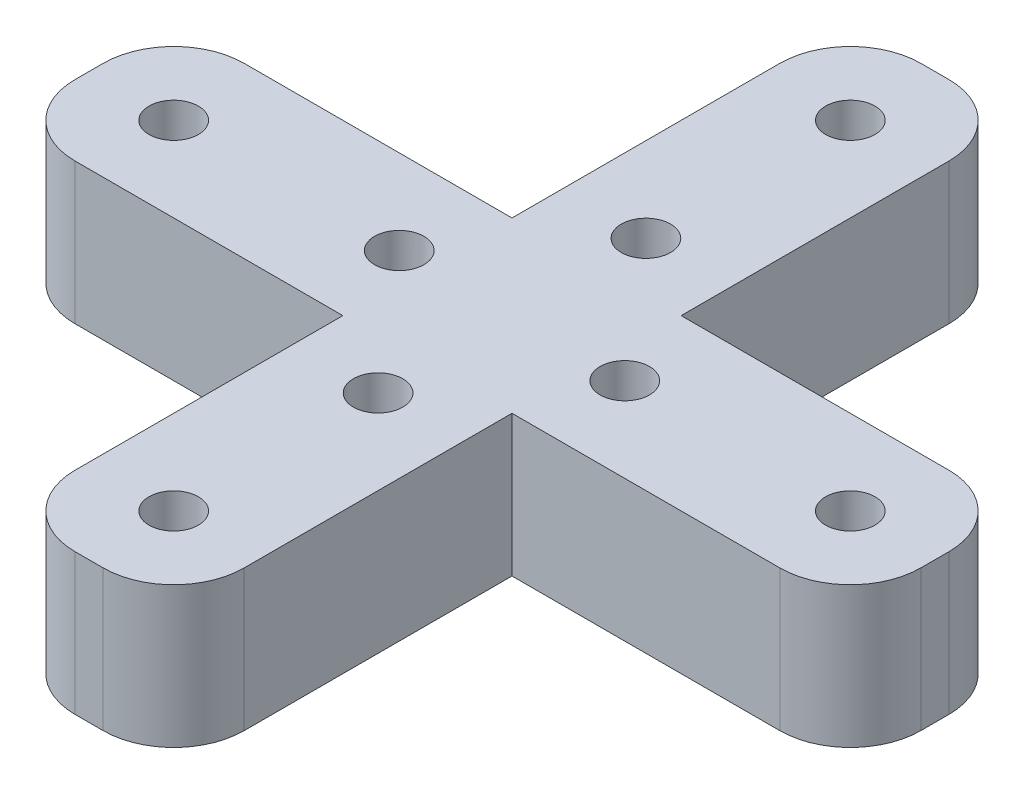
ISO-10303-21;
HEADER;
FILE_DESCRIPTION(('STEP AP214'),'2;1');
FILE_NAME('part.step','',(''),(''),'','','');
FILE_SCHEMA(('AUTOMOTIVE_DESIGN { 1 0 10303 214 1 1 1 1 }'));
ENDSEC;
DATA;
#1=APPLICATION_CONTEXT('core data for automotive mechanical design processes');
#2=APPLICATION_PROTOCOL_DEFINITION('international standard','automotive_design',2000,#1);
#3=PRODUCT_CONTEXT('',#1,'mechanical');
#4=PRODUCT('Part','Part','',(#3));
#5=PRODUCT_RELATED_PRODUCT_CATEGORY('part','',(#4));
#6=PRODUCT_DEFINITION_FORMATION('','',#4);
#7=PRODUCT_DEFINITION_CONTEXT('part definition',#1,'design');
#8=PRODUCT_DEFINITION('design','',#6,#7);
#9=PRODUCT_DEFINITION_SHAPE('','',#8);
#10=(LENGTH_UNIT() NAMED_UNIT(*) SI_UNIT(.MILLI.,.METRE.));
#11=(NAMED_UNIT(*) PLANE_ANGLE_UNIT() SI_UNIT($,.RADIAN.));
#12=(NAMED_UNIT(*) SI_UNIT($,.STERADIAN.) SOLID_ANGLE_UNIT());
#13=UNCERTAINTY_MEASURE_WITH_UNIT(LENGTH_MEASURE(1.E-05),#10,'distance_accuracy_value','');
#14=(GEOMETRIC_REPRESENTATION_CONTEXT(3) GLOBAL_UNCERTAINTY_ASSIGNED_CONTEXT((#13)) GLOBAL_UNIT_ASSIGNED_CONTEXT((#10,
#11,#12)) REPRESENTATION_CONTEXT('',''));
#15=CARTESIAN_POINT('',(0.,0.,0.));
#16=DIRECTION('',(0.,0.,1.));
#17=DIRECTION('',(1.,0.,0.));
#18=AXIS2_PLACEMENT_3D('',#15,#16,#17);
#19=CARTESIAN_POINT('',(-8.,-5.,0.));
#20=DIRECTION('',(0.,1.,0.));
#21=DIRECTION('',(0.,0.,1.));
#22=AXIS2_PLACEMENT_3D('',#19,#20,#21);
#23=CYLINDRICAL_SURFACE('',#22,1.75);
#24=CARTESIAN_POINT('',(-8.,10.,0.));
#25=DIRECTION('',(0.,1.,0.));
#26=DIRECTION('',(0.,0.,1.));
#27=AXIS2_PLACEMENT_3D('',#24,#25,#26);
#28=CIRCLE('',#27,1.75);
#29=CARTESIAN_POINT('',(-8.,10.,1.75));
#30=VERTEX_POINT('',#29);
#31=EDGE_CURVE('E230',#30,#30,#28,.T.);
#32=ORIENTED_EDGE('',*,*,#31,.T.);
#33=EDGE_LOOP('',(#32));
#34=FACE_BOUND('',#33,.T.);
#35=CARTESIAN_POINT('',(-8.,3.,0.));
#36=DIRECTION('',(0.,-1.,0.));
#37=DIRECTION('',(0.,0.,-1.));
#38=AXIS2_PLACEMENT_3D('',#35,#36,#37);
#39=CIRCLE('',#38,1.75);
#40=CARTESIAN_POINT('',(-8.,3.,-1.75));
#41=VERTEX_POINT('',#40);
#42=EDGE_CURVE('E39',#41,#41,#39,.F.);
#43=ORIENTED_EDGE('',*,*,#42,.F.);
#44=EDGE_LOOP('',(#43));
#45=FACE_BOUND('',#44,.T.);
#46=ADVANCED_FACE('F35',(#34,#45),#23,.F.);
#47=CARTESIAN_POINT('',(0.,-5.,9.50000000000001));
#48=DIRECTION('',(0.,1.,0.));
#49=DIRECTION('',(0.,0.,1.));
#50=AXIS2_PLACEMENT_3D('',#47,#48,#49);
#51=CYLINDRICAL_SURFACE('',#50,1.75);
#52=CARTESIAN_POINT('',(0.,10.,9.50000000000001));
#53=DIRECTION('',(0.,1.,0.));
#54=DIRECTION('',(0.,0.,1.));
#55=AXIS2_PLACEMENT_3D('',#52,#53,#54);
#56=CIRCLE('',#55,1.75);
#57=CARTESIAN_POINT('',(0.,10.,11.25));
#58=VERTEX_POINT('',#57);
#59=EDGE_CURVE('E330',#58,#58,#56,.T.);
#60=ORIENTED_EDGE('',*,*,#59,.T.);
#61=EDGE_LOOP('',(#60));
#62=FACE_BOUND('',#61,.T.);
#63=CARTESIAN_POINT('',(0.,3.,9.50000000000001));
#64=DIRECTION('',(0.,-1.,0.));
#65=DIRECTION('',(0.,0.,-1.));
#66=AXIS2_PLACEMENT_3D('',#63,#64,#65);
#67=CIRCLE('',#66,1.75);
#68=CARTESIAN_POINT('',(0.,3.,7.75000000000001));
#69=VERTEX_POINT('',#68);
#70=EDGE_CURVE('E349',#69,#69,#67,.F.);
#71=ORIENTED_EDGE('',*,*,#70,.F.);
#72=EDGE_LOOP('',(#71));
#73=FACE_BOUND('',#72,.T.);
#74=ADVANCED_FACE('F473',(#62,#73),#51,.F.);
#75=CARTESIAN_POINT('',(8.,-5.,0.));
#76=DIRECTION('',(0.,1.,0.));
#77=DIRECTION('',(0.,0.,1.));
#78=AXIS2_PLACEMENT_3D('',#75,#76,#77);
#79=CYLINDRICAL_SURFACE('',#78,1.75);
#80=CARTESIAN_POINT('',(8.,10.,0.));
#81=DIRECTION('',(0.,1.,0.));
#82=DIRECTION('',(0.,0.,1.));
#83=AXIS2_PLACEMENT_3D('',#80,#81,#82);
#84=CIRCLE('',#83,1.75);
#85=CARTESIAN_POINT('',(8.,10.,1.75));
#86=VERTEX_POINT('',#85);
#87=EDGE_CURVE('E375',#86,#86,#84,.T.);
#88=ORIENTED_EDGE('',*,*,#87,.T.);
#89=EDGE_LOOP('',(#88));
#90=FACE_BOUND('',#89,.T.);
#91=CARTESIAN_POINT('',(8.,3.,0.));
#92=DIRECTION('',(0.,-1.,0.));
#93=DIRECTION('',(0.,0.,-1.));
#94=AXIS2_PLACEMENT_3D('',#91,#92,#93);
#95=CIRCLE('',#94,1.75);
#96=CARTESIAN_POINT('',(8.,3.,-1.75));
#97=VERTEX_POINT('',#96);
#98=EDGE_CURVE('E347',#97,#97,#95,.F.);
#99=ORIENTED_EDGE('',*,*,#98,.F.);
#100=EDGE_LOOP('',(#99));
#101=FACE_BOUND('',#100,.T.);
#102=ADVANCED_FACE('F468',(#90,#101),#79,.F.);
#103=CARTESIAN_POINT('',(0.,-5.,-9.49999999999999));
#104=DIRECTION('',(0.,1.,0.));
#105=DIRECTION('',(0.,0.,1.));
#106=AXIS2_PLACEMENT_3D('',#103,#104,#105);
#107=CYLINDRICAL_SURFACE('',#106,1.75);
#108=CARTESIAN_POINT('',(0.,10.,-9.49999999999999));
#109=DIRECTION('',(0.,1.,0.));
#110=DIRECTION('',(0.,0.,1.));
#111=AXIS2_PLACEMENT_3D('',#108,#109,#110);
#112=CIRCLE('',#111,1.75);
#113=CARTESIAN_POINT('',(0.,10.,-7.74999999999999));
#114=VERTEX_POINT('',#113);
#115=EDGE_CURVE('E378',#114,#114,#112,.T.);
#116=ORIENTED_EDGE('',*,*,#115,.T.);
#117=EDGE_LOOP('',(#116));
#118=FACE_BOUND('',#117,.T.);
#119=CARTESIAN_POINT('',(0.,3.,-9.49999999999999));
#120=DIRECTION('',(0.,-1.,0.));
#121=DIRECTION('',(0.,0.,-1.));
#122=AXIS2_PLACEMENT_3D('',#119,#120,#121);
#123=CIRCLE('',#122,1.75);
#124=CARTESIAN_POINT('',(0.,3.,-11.25));
#125=VERTEX_POINT('',#124);
#126=EDGE_CURVE('E342',#125,#125,#123,.F.);
#127=ORIENTED_EDGE('',*,*,#126,.F.);
#128=EDGE_LOOP('',(#127));
#129=FACE_BOUND('',#128,.T.);
#130=ADVANCED_FACE('F461',(#118,#129),#107,.F.);
#131=CARTESIAN_POINT('',(6.,10.,-5.99999999999999));
#132=DIRECTION('',(-1.,0.,0.));
#133=DIRECTION('',(0.,0.,1.));
#134=AXIS2_PLACEMENT_3D('',#131,#132,#133);
#135=PLANE('',#134);
#136=DIRECTION('',(0.,0.,-1.));
#137=VECTOR('',#136,1.);
#138=CARTESIAN_POINT('',(6.,0.,-5.99999999999999));
#139=LINE('',#138,#137);
#140=CARTESIAN_POINT('',(6.,0.,-5.99999999999999));
#141=VERTEX_POINT('',#140);
#142=CARTESIAN_POINT('',(6.,0.,-25.));
#143=VERTEX_POINT('',#142);
#144=EDGE_CURVE('E226',#141,#143,#139,.T.);
#145=ORIENTED_EDGE('',*,*,#144,.T.);
#146=DIRECTION('',(0.,-1.,0.));
#147=VECTOR('',#146,1.);
#148=CARTESIAN_POINT('',(6.,10.,-25.));
#149=LINE('',#148,#147);
#150=CARTESIAN_POINT('',(6.,10.,-25.));
#151=VERTEX_POINT('',#150);
#152=EDGE_CURVE('E317',#143,#151,#149,.F.);
#153=ORIENTED_EDGE('',*,*,#152,.T.);
#154=DIRECTION('',(0.,0.,-1.));
#155=VECTOR('',#154,1.);
#156=CARTESIAN_POINT('',(6.,10.,-5.99999999999999));
#157=LINE('',#156,#155);
#158=CARTESIAN_POINT('',(6.,10.,-5.99999999999999));
#159=VERTEX_POINT('',#158);
#160=EDGE_CURVE('E256',#159,#151,#157,.T.);
#161=ORIENTED_EDGE('',*,*,#160,.F.);
#162=DIRECTION('',(0.,-1.,0.));
#163=VECTOR('',#162,1.);
#164=CARTESIAN_POINT('',(6.,10.,-5.99999999999999));
#165=LINE('',#164,#163);
#166=EDGE_CURVE('E225',#159,#141,#165,.T.);
#167=ORIENTED_EDGE('',*,*,#166,.T.);
#168=EDGE_LOOP('',(#145,#153,#161,#167));
#169=FACE_BOUND('',#168,.T.);
#170=ADVANCED_FACE('F459',(#169),#135,.F.);
#171=CARTESIAN_POINT('',(-6.,10.,-30.));
#172=DIRECTION('',(0.,0.,1.));
#173=DIRECTION('',(1.,0.,0.));
#174=AXIS2_PLACEMENT_3D('',#171,#172,#173);
#175=PLANE('',#174);
#176=DIRECTION('',(-1.,0.,0.));
#177=VECTOR('',#176,1.);
#178=CARTESIAN_POINT('',(-6.,10.,-30.));
#179=LINE('',#178,#177);
#180=CARTESIAN_POINT('',(1.,10.,-30.));
#181=VERTEX_POINT('',#180);
#182=CARTESIAN_POINT('',(-1.,10.,-30.));
#183=VERTEX_POINT('',#182);
#184=EDGE_CURVE('E188',#181,#183,#179,.T.);
#185=ORIENTED_EDGE('',*,*,#184,.F.);
#186=DIRECTION('',(0.,-1.,0.));
#187=VECTOR('',#186,1.);
#188=CARTESIAN_POINT('',(1.,10.,-30.));
#189=LINE('',#188,#187);
#190=CARTESIAN_POINT('',(1.,0.,-30.));
#191=VERTEX_POINT('',#190);
#192=EDGE_CURVE('E314',#181,#191,#189,.T.);
#193=ORIENTED_EDGE('',*,*,#192,.T.);
#194=DIRECTION('',(-1.,0.,0.));
#195=VECTOR('',#194,1.);
#196=CARTESIAN_POINT('',(-6.,0.,-30.));
#197=LINE('',#196,#195);
#198=CARTESIAN_POINT('',(-1.,0.,-30.));
#199=VERTEX_POINT('',#198);
#200=EDGE_CURVE('E229',#191,#199,#197,.T.);
#201=ORIENTED_EDGE('',*,*,#200,.T.);
#202=DIRECTION('',(0.,-1.,0.));
#203=VECTOR('',#202,1.);
#204=CARTESIAN_POINT('',(-1.,10.,-30.));
#205=LINE('',#204,#203);
#206=EDGE_CURVE('E312',#199,#183,#205,.F.);
#207=ORIENTED_EDGE('',*,*,#206,.T.);
#208=EDGE_LOOP('',(#185,#193,#201,#207));
#209=FACE_BOUND('',#208,.T.);
#210=ADVANCED_FACE('F458',(#209),#175,.F.);
#211=CARTESIAN_POINT('',(-6.,10.,-5.99999999999999));
#212=DIRECTION('',(1.,0.,0.));
#213=DIRECTION('',(0.,0.,-1.));
#214=AXIS2_PLACEMENT_3D('',#211,#212,#213);
#215=PLANE('',#214);
#216=DIRECTION('',(0.,0.,1.));
#217=VECTOR('',#216,1.);
#218=CARTESIAN_POINT('',(-6.,10.,-5.99999999999999));
#219=LINE('',#218,#217);
#220=CARTESIAN_POINT('',(-6.,10.,-25.));
#221=VERTEX_POINT('',#220);
#222=CARTESIAN_POINT('',(-6.,10.,-5.99999999999999));
#223=VERTEX_POINT('',#222);
#224=EDGE_CURVE('E175',#221,#223,#219,.T.);
#225=ORIENTED_EDGE('',*,*,#224,.F.);
#226=DIRECTION('',(0.,-1.,0.));
#227=VECTOR('',#226,1.);
#228=CARTESIAN_POINT('',(-6.,10.,-25.));
#229=LINE('',#228,#227);
#230=CARTESIAN_POINT('',(-6.,0.,-25.));
#231=VERTEX_POINT('',#230);
#232=EDGE_CURVE('E319',#221,#231,#229,.T.);
#233=ORIENTED_EDGE('',*,*,#232,.T.);
#234=DIRECTION('',(0.,0.,1.));
#235=VECTOR('',#234,1.);
#236=CARTESIAN_POINT('',(-6.,0.,-5.99999999999999));
#237=LINE('',#236,#235);
#238=CARTESIAN_POINT('',(-6.,0.,-5.99999999999999));
#239=VERTEX_POINT('',#238);
#240=EDGE_CURVE('E194',#231,#239,#237,.T.);
#241=ORIENTED_EDGE('',*,*,#240,.T.);
#242=DIRECTION('',(0.,-1.,0.));
#243=VECTOR('',#242,1.);
#244=CARTESIAN_POINT('',(-6.,10.,-5.99999999999999));
#245=LINE('',#244,#243);
#246=EDGE_CURVE('E191',#223,#239,#245,.T.);
#247=ORIENTED_EDGE('',*,*,#246,.F.);
#248=EDGE_LOOP('',(#225,#233,#241,#247));
#249=FACE_BOUND('',#248,.T.);
#250=ADVANCED_FACE('F192',(#249),#215,.F.);
#251=CARTESIAN_POINT('',(-30.,10.,-5.99999999999999));
#252=DIRECTION('',(0.,0.,1.));
#253=DIRECTION('',(1.,0.,0.));
#254=AXIS2_PLACEMENT_3D('',#251,#252,#253);
#255=PLANE('',#254);
#256=DIRECTION('',(-1.,0.,0.));
#257=VECTOR('',#256,1.);
#258=CARTESIAN_POINT('',(-30.,0.,-5.99999999999999));
#259=LINE('',#258,#257);
#260=CARTESIAN_POINT('',(-25.,0.,-5.99999999999999));
#261=VERTEX_POINT('',#260);
#262=EDGE_CURVE('E234',#239,#261,#259,.T.);
#263=ORIENTED_EDGE('',*,*,#262,.T.);
#264=DIRECTION('',(0.,-1.,0.));
#265=VECTOR('',#264,1.);
#266=CARTESIAN_POINT('',(-25.,10.,-5.99999999999999));
#267=LINE('',#266,#265);
#268=CARTESIAN_POINT('',(-25.,10.,-5.99999999999999));
#269=VERTEX_POINT('',#268);
#270=EDGE_CURVE('E44',#261,#269,#267,.F.);
#271=ORIENTED_EDGE('',*,*,#270,.T.);
#272=DIRECTION('',(-1.,0.,0.));
#273=VECTOR('',#272,1.);
#274=CARTESIAN_POINT('',(-30.,10.,-5.99999999999999));
#275=LINE('',#274,#273);
#276=EDGE_CURVE('E180',#223,#269,#275,.T.);
#277=ORIENTED_EDGE('',*,*,#276,.F.);
#278=ORIENTED_EDGE('',*,*,#246,.T.);
#279=EDGE_LOOP('',(#263,#271,#277,#278));
#280=FACE_BOUND('',#279,.T.);
#281=ADVANCED_FACE('F201',(#280),#255,.F.);
#282=CARTESIAN_POINT('',(-30.,10.,-5.99999999999999));
#283=DIRECTION('',(1.,0.,0.));
#284=DIRECTION('',(0.,0.,-1.));
#285=AXIS2_PLACEMENT_3D('',#282,#283,#284);
#286=PLANE('',#285);
#287=DIRECTION('',(0.,0.,1.));
#288=VECTOR('',#287,1.);
#289=CARTESIAN_POINT('',(-30.,10.,-5.99999999999999));
#290=LINE('',#289,#288);
#291=CARTESIAN_POINT('',(-30.,10.,-0.999999999999991));
#292=VERTEX_POINT('',#291);
#293=CARTESIAN_POINT('',(-30.,10.,1.00000000000001));
#294=VERTEX_POINT('',#293);
#295=EDGE_CURVE('E203',#292,#294,#290,.T.);
#296=ORIENTED_EDGE('',*,*,#295,.F.);
#297=DIRECTION('',(0.,-1.,0.));
#298=VECTOR('',#297,1.);
#299=CARTESIAN_POINT('',(-30.,10.,-0.999999999999991));
#300=LINE('',#299,#298);
#301=CARTESIAN_POINT('',(-30.,0.,-0.999999999999991));
#302=VERTEX_POINT('',#301);
#303=EDGE_CURVE('E323',#292,#302,#300,.T.);
#304=ORIENTED_EDGE('',*,*,#303,.T.);
#305=DIRECTION('',(0.,0.,1.));
#306=VECTOR('',#305,1.);
#307=CARTESIAN_POINT('',(-30.,0.,-5.99999999999999));
#308=LINE('',#307,#306);
#309=CARTESIAN_POINT('',(-30.,0.,1.00000000000001));
#310=VERTEX_POINT('',#309);
#311=EDGE_CURVE('E236',#302,#310,#308,.T.);
#312=ORIENTED_EDGE('',*,*,#311,.T.);
#313=DIRECTION('',(0.,-1.,0.));
#314=VECTOR('',#313,1.);
#315=CARTESIAN_POINT('',(-30.,10.,1.00000000000001));
#316=LINE('',#315,#314);
#317=EDGE_CURVE('E321',#310,#294,#316,.F.);
#318=ORIENTED_EDGE('',*,*,#317,.T.);
#319=EDGE_LOOP('',(#296,#304,#312,#318));
#320=FACE_BOUND('',#319,.T.);
#321=ADVANCED_FACE('F404',(#320),#286,.F.);
#322=CARTESIAN_POINT('',(-30.,10.,6.00000000000001));
#323=DIRECTION('',(0.,0.,-1.));
#324=DIRECTION('',(-1.,0.,0.));
#325=AXIS2_PLACEMENT_3D('',#322,#323,#324);
#326=PLANE('',#325);
#327=DIRECTION('',(1.,0.,0.));
#328=VECTOR('',#327,1.);
#329=CARTESIAN_POINT('',(-30.,10.,6.00000000000001));
#330=LINE('',#329,#328);
#331=CARTESIAN_POINT('',(-25.,10.,6.00000000000001));
#332=VERTEX_POINT('',#331);
#333=CARTESIAN_POINT('',(-6.,10.,6.00000000000001));
#334=VERTEX_POINT('',#333);
#335=EDGE_CURVE('E206',#332,#334,#330,.T.);
#336=ORIENTED_EDGE('',*,*,#335,.F.);
#337=DIRECTION('',(0.,-1.,0.));
#338=VECTOR('',#337,1.);
#339=CARTESIAN_POINT('',(-25.,10.,6.00000000000001));
#340=LINE('',#339,#338);
#341=CARTESIAN_POINT('',(-25.,0.,6.00000000000001));
#342=VERTEX_POINT('',#341);
#343=EDGE_CURVE('E11',#332,#342,#340,.T.);
#344=ORIENTED_EDGE('',*,*,#343,.T.);
#345=DIRECTION('',(1.,0.,0.));
#346=VECTOR('',#345,1.);
#347=CARTESIAN_POINT('',(-30.,0.,6.00000000000001));
#348=LINE('',#347,#346);
#349=CARTESIAN_POINT('',(-6.,0.,6.00000000000001));
#350=VERTEX_POINT('',#349);
#351=EDGE_CURVE('E239',#342,#350,#348,.T.);
#352=ORIENTED_EDGE('',*,*,#351,.T.);
#353=DIRECTION('',(0.,-1.,0.));
#354=VECTOR('',#353,1.);
#355=CARTESIAN_POINT('',(-6.,10.,6.00000000000001));
#356=LINE('',#355,#354);
#357=EDGE_CURVE('E199',#334,#350,#356,.T.);
#358=ORIENTED_EDGE('',*,*,#357,.F.);
#359=EDGE_LOOP('',(#336,#344,#352,#358));
#360=FACE_BOUND('',#359,.T.);
#361=ADVANCED_FACE('F411',(#360),#326,.F.);
#362=CARTESIAN_POINT('',(-6.,10.,30.));
#363=DIRECTION('',(1.,0.,0.));
#364=DIRECTION('',(0.,0.,-1.));
#365=AXIS2_PLACEMENT_3D('',#362,#363,#364);
#366=PLANE('',#365);
#367=DIRECTION('',(0.,0.,1.));
#368=VECTOR('',#367,1.);
#369=CARTESIAN_POINT('',(-6.,0.,30.));
#370=LINE('',#369,#368);
#371=CARTESIAN_POINT('',(-6.,0.,25.));
#372=VERTEX_POINT('',#371);
#373=EDGE_CURVE('E241',#350,#372,#370,.T.);
#374=ORIENTED_EDGE('',*,*,#373,.T.);
#375=DIRECTION('',(0.,-1.,0.));
#376=VECTOR('',#375,1.);
#377=CARTESIAN_POINT('',(-6.,10.,25.));
#378=LINE('',#377,#376);
#379=CARTESIAN_POINT('',(-6.,10.,25.));
#380=VERTEX_POINT('',#379);
#381=EDGE_CURVE('E284',#372,#380,#378,.F.);
#382=ORIENTED_EDGE('',*,*,#381,.T.);
#383=DIRECTION('',(0.,0.,1.));
#384=VECTOR('',#383,1.);
#385=CARTESIAN_POINT('',(-6.,10.,30.));
#386=LINE('',#385,#384);
#387=EDGE_CURVE('E211',#334,#380,#386,.T.);
#388=ORIENTED_EDGE('',*,*,#387,.F.);
#389=ORIENTED_EDGE('',*,*,#357,.T.);
#390=EDGE_LOOP('',(#374,#382,#388,#389));
#391=FACE_BOUND('',#390,.T.);
#392=ADVANCED_FACE('F416',(#391),#366,.F.);
#393=CARTESIAN_POINT('',(-6.,10.,30.));
#394=DIRECTION('',(0.,0.,-1.));
#395=DIRECTION('',(-1.,0.,0.));
#396=AXIS2_PLACEMENT_3D('',#393,#394,#395);
#397=PLANE('',#396);
#398=DIRECTION('',(1.,0.,0.));
#399=VECTOR('',#398,1.);
#400=CARTESIAN_POINT('',(-6.,10.,30.));
#401=LINE('',#400,#399);
#402=CARTESIAN_POINT('',(-0.999999999999999,10.,30.));
#403=VERTEX_POINT('',#402);
#404=CARTESIAN_POINT('',(0.999999999999999,10.,30.));
#405=VERTEX_POINT('',#404);
#406=EDGE_CURVE('E213',#403,#405,#401,.T.);
#407=ORIENTED_EDGE('',*,*,#406,.F.);
#408=DIRECTION('',(0.,-1.,0.));
#409=VECTOR('',#408,1.);
#410=CARTESIAN_POINT('',(-0.999999999999999,10.,30.));
#411=LINE('',#410,#409);
#412=CARTESIAN_POINT('',(-0.999999999999999,0.,30.));
#413=VERTEX_POINT('',#412);
#414=EDGE_CURVE('E265',#403,#413,#411,.T.);
#415=ORIENTED_EDGE('',*,*,#414,.T.);
#416=DIRECTION('',(1.,0.,0.));
#417=VECTOR('',#416,1.);
#418=CARTESIAN_POINT('',(-6.,0.,30.));
#419=LINE('',#418,#417);
#420=CARTESIAN_POINT('',(0.999999999999999,0.,30.));
#421=VERTEX_POINT('',#420);
#422=EDGE_CURVE('E244',#413,#421,#419,.T.);
#423=ORIENTED_EDGE('',*,*,#422,.T.);
#424=DIRECTION('',(0.,-1.,0.));
#425=VECTOR('',#424,1.);
#426=CARTESIAN_POINT('',(0.999999999999999,10.,30.));
#427=LINE('',#426,#425);
#428=EDGE_CURVE('E198',#421,#405,#427,.F.);
#429=ORIENTED_EDGE('',*,*,#428,.T.);
#430=EDGE_LOOP('',(#407,#415,#423,#429));
#431=FACE_BOUND('',#430,.T.);
#432=ADVANCED_FACE('F424',(#431),#397,.F.);
#433=CARTESIAN_POINT('',(6.,10.,30.));
#434=DIRECTION('',(-1.,0.,0.));
#435=DIRECTION('',(0.,0.,1.));
#436=AXIS2_PLACEMENT_3D('',#433,#434,#435);
#437=PLANE('',#436);
#438=DIRECTION('',(0.,0.,-1.));
#439=VECTOR('',#438,1.);
#440=CARTESIAN_POINT('',(6.,10.,30.));
#441=LINE('',#440,#439);
#442=CARTESIAN_POINT('',(6.,10.,25.));
#443=VERTEX_POINT('',#442);
#444=CARTESIAN_POINT('',(5.99999999999999,10.,6.00000000000001));
#445=VERTEX_POINT('',#444);
#446=EDGE_CURVE('E216',#443,#445,#441,.T.);
#447=ORIENTED_EDGE('',*,*,#446,.F.);
#448=DIRECTION('',(0.,-1.,0.));
#449=VECTOR('',#448,1.);
#450=CARTESIAN_POINT('',(6.,10.,25.));
#451=LINE('',#450,#449);
#452=CARTESIAN_POINT('',(6.,0.,25.));
#453=VERTEX_POINT('',#452);
#454=EDGE_CURVE('E300',#443,#453,#451,.T.);
#455=ORIENTED_EDGE('',*,*,#454,.T.);
#456=DIRECTION('',(0.,0.,-1.));
#457=VECTOR('',#456,1.);
#458=CARTESIAN_POINT('',(6.,0.,30.));
#459=LINE('',#458,#457);
#460=CARTESIAN_POINT('',(5.99999999999999,0.,6.00000000000001));
#461=VERTEX_POINT('',#460);
#462=EDGE_CURVE('E247',#453,#461,#459,.T.);
#463=ORIENTED_EDGE('',*,*,#462,.T.);
#464=DIRECTION('',(0.,-1.,0.));
#465=VECTOR('',#464,1.);
#466=CARTESIAN_POINT('',(5.99999999999999,10.,6.00000000000001));
#467=LINE('',#466,#465);
#468=EDGE_CURVE('E259',#445,#461,#467,.T.);
#469=ORIENTED_EDGE('',*,*,#468,.F.);
#470=EDGE_LOOP('',(#447,#455,#463,#469));
#471=FACE_BOUND('',#470,.T.);
#472=ADVANCED_FACE('F434',(#471),#437,.F.);
#473=CARTESIAN_POINT('',(5.99999999999999,10.,6.00000000000001));
#474=DIRECTION('',(0.,0.,-1.));
#475=DIRECTION('',(-1.,0.,0.));
#476=AXIS2_PLACEMENT_3D('',#473,#474,#475);
#477=PLANE('',#476);
#478=DIRECTION('',(1.,0.,0.));
#479=VECTOR('',#478,1.);
#480=CARTESIAN_POINT('',(5.99999999999999,0.,6.00000000000001));
#481=LINE('',#480,#479);
#482=CARTESIAN_POINT('',(25.,0.,6.00000000000001));
#483=VERTEX_POINT('',#482);
#484=EDGE_CURVE('E249',#461,#483,#481,.T.);
#485=ORIENTED_EDGE('',*,*,#484,.T.);
#486=DIRECTION('',(0.,-1.,0.));
#487=VECTOR('',#486,1.);
#488=CARTESIAN_POINT('',(25.,10.,6.00000000000001));
#489=LINE('',#488,#487);
#490=CARTESIAN_POINT('',(25.,10.,6.00000000000001));
#491=VERTEX_POINT('',#490);
#492=EDGE_CURVE('E307',#483,#491,#489,.F.);
#493=ORIENTED_EDGE('',*,*,#492,.T.);
#494=DIRECTION('',(1.,0.,0.));
#495=VECTOR('',#494,1.);
#496=CARTESIAN_POINT('',(5.99999999999999,10.,6.00000000000001));
#497=LINE('',#496,#495);
#498=EDGE_CURVE('E218',#445,#491,#497,.T.);
#499=ORIENTED_EDGE('',*,*,#498,.F.);
#500=ORIENTED_EDGE('',*,*,#468,.T.);
#501=EDGE_LOOP('',(#485,#493,#499,#500));
#502=FACE_BOUND('',#501,.T.);
#503=ADVANCED_FACE('F493',(#502),#477,.F.);
#504=CARTESIAN_POINT('',(30.,10.,-5.99999999999999));
#505=DIRECTION('',(-1.,0.,0.));
#506=DIRECTION('',(0.,0.,1.));
#507=AXIS2_PLACEMENT_3D('',#504,#505,#506);
#508=PLANE('',#507);
#509=DIRECTION('',(0.,0.,-1.));
#510=VECTOR('',#509,1.);
#511=CARTESIAN_POINT('',(30.,10.,-5.99999999999999));
#512=LINE('',#511,#510);
#513=CARTESIAN_POINT('',(30.,10.,1.00000000000001));
#514=VERTEX_POINT('',#513);
#515=CARTESIAN_POINT('',(30.,10.,-0.999999999999993));
#516=VERTEX_POINT('',#515);
#517=EDGE_CURVE('E221',#514,#516,#512,.T.);
#518=ORIENTED_EDGE('',*,*,#517,.F.);
#519=DIRECTION('',(0.,-1.,0.));
#520=VECTOR('',#519,1.);
#521=CARTESIAN_POINT('',(30.,10.,1.00000000000001));
#522=LINE('',#521,#520);
#523=CARTESIAN_POINT('',(30.,0.,1.00000000000001));
#524=VERTEX_POINT('',#523);
#525=EDGE_CURVE('E304',#514,#524,#522,.T.);
#526=ORIENTED_EDGE('',*,*,#525,.T.);
#527=DIRECTION('',(0.,0.,-1.));
#528=VECTOR('',#527,1.);
#529=CARTESIAN_POINT('',(30.,0.,-5.99999999999999));
#530=LINE('',#529,#528);
#531=CARTESIAN_POINT('',(30.,0.,-0.999999999999993));
#532=VERTEX_POINT('',#531);
#533=EDGE_CURVE('E252',#524,#532,#530,.T.);
#534=ORIENTED_EDGE('',*,*,#533,.T.);
#535=DIRECTION('',(0.,-1.,0.));
#536=VECTOR('',#535,1.);
#537=CARTESIAN_POINT('',(30.,10.,-0.999999999999993));
#538=LINE('',#537,#536);
#539=EDGE_CURVE('E60',#532,#516,#538,.F.);
#540=ORIENTED_EDGE('',*,*,#539,.T.);
#541=EDGE_LOOP('',(#518,#526,#534,#540));
#542=FACE_BOUND('',#541,.T.);
#543=ADVANCED_FACE('F444',(#542),#508,.F.);
#544=CARTESIAN_POINT('',(6.,10.,-5.99999999999999));
#545=DIRECTION('',(0.,0.,1.));
#546=DIRECTION('',(1.,0.,0.));
#547=AXIS2_PLACEMENT_3D('',#544,#545,#546);
#548=PLANE('',#547);
#549=DIRECTION('',(-1.,0.,0.));
#550=VECTOR('',#549,1.);
#551=CARTESIAN_POINT('',(6.,10.,-5.99999999999999));
#552=LINE('',#551,#550);
#553=CARTESIAN_POINT('',(25.,10.,-5.99999999999999));
#554=VERTEX_POINT('',#553);
#555=EDGE_CURVE('E223',#554,#159,#552,.T.);
#556=ORIENTED_EDGE('',*,*,#555,.F.);
#557=DIRECTION('',(0.,-1.,0.));
#558=VECTOR('',#557,1.);
#559=CARTESIAN_POINT('',(25.,10.,-5.99999999999999));
#560=LINE('',#559,#558);
#561=CARTESIAN_POINT('',(25.,0.,-5.99999999999999));
#562=VERTEX_POINT('',#561);
#563=EDGE_CURVE('E309',#554,#562,#560,.T.);
#564=ORIENTED_EDGE('',*,*,#563,.T.);
#565=DIRECTION('',(-1.,0.,0.));
#566=VECTOR('',#565,1.);
#567=CARTESIAN_POINT('',(6.,0.,-5.99999999999999));
#568=LINE('',#567,#566);
#569=EDGE_CURVE('E254',#562,#141,#568,.T.);
#570=ORIENTED_EDGE('',*,*,#569,.T.);
#571=ORIENTED_EDGE('',*,*,#166,.F.);
#572=EDGE_LOOP('',(#556,#564,#570,#571));
#573=FACE_BOUND('',#572,.T.);
#574=ADVANCED_FACE('F451',(#573),#548,.F.);
#575=CARTESIAN_POINT('',(0.,10.,0.));
#576=DIRECTION('',(0.,-1.,0.));
#577=DIRECTION('',(0.,0.,-1.));
#578=AXIS2_PLACEMENT_3D('',#575,#576,#577);
#579=PLANE('',#578);
#580=CARTESIAN_POINT('',(24.,10.,0.));
#581=DIRECTION('',(0.,1.,0.));
#582=DIRECTION('',(0.,0.,1.));
#583=AXIS2_PLACEMENT_3D('',#580,#581,#582);
#584=CIRCLE('',#583,1.75);
#585=CARTESIAN_POINT('',(24.,10.,1.75));
#586=VERTEX_POINT('',#585);
#587=EDGE_CURVE('E336',#586,#586,#584,.T.);
#588=ORIENTED_EDGE('',*,*,#587,.F.);
#589=EDGE_LOOP('',(#588));
#590=FACE_BOUND('',#589,.T.);
#591=CARTESIAN_POINT('',(-24.,10.,0.));
#592=DIRECTION('',(0.,1.,0.));
#593=DIRECTION('',(0.,0.,1.));
#594=AXIS2_PLACEMENT_3D('',#591,#592,#593);
#595=CIRCLE('',#594,1.75);
#596=CARTESIAN_POINT('',(-24.,10.,1.75));
#597=VERTEX_POINT('',#596);
#598=EDGE_CURVE('E368',#597,#597,#595,.T.);
#599=ORIENTED_EDGE('',*,*,#598,.F.);
#600=EDGE_LOOP('',(#599));
#601=FACE_BOUND('',#600,.T.);
#602=CARTESIAN_POINT('',(0.,10.,24.));
#603=DIRECTION('',(0.,1.,0.));
#604=DIRECTION('',(0.,0.,1.));
#605=AXIS2_PLACEMENT_3D('',#602,#603,#604);
#606=CIRCLE('',#605,1.75);
#607=CARTESIAN_POINT('',(0.,10.,25.75));
#608=VERTEX_POINT('',#607);
#609=EDGE_CURVE('E345',#608,#608,#606,.T.);
#610=ORIENTED_EDGE('',*,*,#609,.F.);
#611=EDGE_LOOP('',(#610));
#612=FACE_BOUND('',#611,.T.);
#613=CARTESIAN_POINT('',(0.,10.,-24.));
#614=DIRECTION('',(0.,1.,0.));
#615=DIRECTION('',(0.,0.,1.));
#616=AXIS2_PLACEMENT_3D('',#613,#614,#615);
#617=CIRCLE('',#616,1.75);
#618=CARTESIAN_POINT('',(0.,10.,-22.25));
#619=VERTEX_POINT('',#618);
#620=EDGE_CURVE('E331',#619,#619,#617,.T.);
#621=ORIENTED_EDGE('',*,*,#620,.F.);
#622=EDGE_LOOP('',(#621));
#623=FACE_BOUND('',#622,.T.);
#624=ORIENTED_EDGE('',*,*,#87,.F.);
#625=EDGE_LOOP('',(#624));
#626=FACE_BOUND('',#625,.T.);
#627=ORIENTED_EDGE('',*,*,#115,.F.);
#628=EDGE_LOOP('',(#627));
#629=FACE_BOUND('',#628,.T.);
#630=ORIENTED_EDGE('',*,*,#59,.F.);
#631=EDGE_LOOP('',(#630));
#632=FACE_BOUND('',#631,.T.);
#633=ORIENTED_EDGE('',*,*,#31,.F.);
#634=EDGE_LOOP('',(#633));
#635=FACE_BOUND('',#634,.T.);
#636=ORIENTED_EDGE('',*,*,#387,.T.);
#637=CARTESIAN_POINT('',(-0.999999999999999,10.,25.));
#638=DIRECTION('',(0.,-1.,0.));
#639=DIRECTION('',(0.,0.,-1.));
#640=AXIS2_PLACEMENT_3D('',#637,#638,#639);
#641=CIRCLE('',#640,5.);
#642=EDGE_CURVE('E298',#380,#403,#641,.F.);
#643=ORIENTED_EDGE('',*,*,#642,.T.);
#644=ORIENTED_EDGE('',*,*,#406,.T.);
#645=CARTESIAN_POINT('',(0.999999999999999,10.,25.));
#646=DIRECTION('',(0.,-1.,0.));
#647=DIRECTION('',(0.,0.,-1.));
#648=AXIS2_PLACEMENT_3D('',#645,#646,#647);
#649=CIRCLE('',#648,5.);
#650=EDGE_CURVE('E296',#405,#443,#649,.F.);
#651=ORIENTED_EDGE('',*,*,#650,.T.);
#652=ORIENTED_EDGE('',*,*,#446,.T.);
#653=ORIENTED_EDGE('',*,*,#498,.T.);
#654=CARTESIAN_POINT('',(25.,10.,1.00000000000001));
#655=DIRECTION('',(0.,-1.,0.));
#656=DIRECTION('',(0.,0.,-1.));
#657=AXIS2_PLACEMENT_3D('',#654,#655,#656);
#658=CIRCLE('',#657,5.);
#659=EDGE_CURVE('E294',#491,#514,#658,.F.);
#660=ORIENTED_EDGE('',*,*,#659,.T.);
#661=ORIENTED_EDGE('',*,*,#517,.T.);
#662=CARTESIAN_POINT('',(25.,10.,-0.999999999999993));
#663=DIRECTION('',(0.,-1.,0.));
#664=DIRECTION('',(0.,0.,-1.));
#665=AXIS2_PLACEMENT_3D('',#662,#663,#664);
#666=CIRCLE('',#665,5.);
#667=EDGE_CURVE('E52',#516,#554,#666,.F.);
#668=ORIENTED_EDGE('',*,*,#667,.T.);
#669=ORIENTED_EDGE('',*,*,#555,.T.);
#670=ORIENTED_EDGE('',*,*,#160,.T.);
#671=CARTESIAN_POINT('',(1.,10.,-25.));
#672=DIRECTION('',(0.,-1.,0.));
#673=DIRECTION('',(0.,0.,-1.));
#674=AXIS2_PLACEMENT_3D('',#671,#672,#673);
#675=CIRCLE('',#674,5.);
#676=EDGE_CURVE('E291',#151,#181,#675,.F.);
#677=ORIENTED_EDGE('',*,*,#676,.T.);
#678=ORIENTED_EDGE('',*,*,#184,.T.);
#679=CARTESIAN_POINT('',(-1.,10.,-25.));
#680=DIRECTION('',(0.,-1.,0.));
#681=DIRECTION('',(0.,0.,-1.));
#682=AXIS2_PLACEMENT_3D('',#679,#680,#681);
#683=CIRCLE('',#682,5.);
#684=EDGE_CURVE('E184',#183,#221,#683,.F.);
#685=ORIENTED_EDGE('',*,*,#684,.T.);
#686=ORIENTED_EDGE('',*,*,#224,.T.);
#687=ORIENTED_EDGE('',*,*,#276,.T.);
#688=CARTESIAN_POINT('',(-25.,10.,-0.999999999999991));
#689=DIRECTION('',(0.,-1.,0.));
#690=DIRECTION('',(0.,0.,-1.));
#691=AXIS2_PLACEMENT_3D('',#688,#689,#690);
#692=CIRCLE('',#691,5.);
#693=EDGE_CURVE('E288',#269,#292,#692,.F.);
#694=ORIENTED_EDGE('',*,*,#693,.T.);
#695=ORIENTED_EDGE('',*,*,#295,.T.);
#696=CARTESIAN_POINT('',(-25.,10.,1.00000000000001));
#697=DIRECTION('',(0.,-1.,0.));
#698=DIRECTION('',(0.,0.,-1.));
#699=AXIS2_PLACEMENT_3D('',#696,#697,#698);
#700=CIRCLE('',#699,5.);
#701=EDGE_CURVE('E286',#294,#332,#700,.F.);
#702=ORIENTED_EDGE('',*,*,#701,.T.);
#703=ORIENTED_EDGE('',*,*,#335,.T.);
#704=EDGE_LOOP('',(#636,#643,#644,#651,#652,#653,#660,#661,#668,#669,#670,#677,#678,#685,#686,
#687,#694,#695,#702,#703));
#705=FACE_BOUND('',#704,.T.);
#706=ADVANCED_FACE('F178',(#590,#601,#612,#623,#626,#629,#632,#635,#705),#579,.F.);
#707=CARTESIAN_POINT('',(0.,0.,0.));
#708=DIRECTION('',(0.,-1.,0.));
#709=DIRECTION('',(0.,0.,-1.));
#710=AXIS2_PLACEMENT_3D('',#707,#708,#709);
#711=PLANE('',#710);
#712=CARTESIAN_POINT('',(-8.,0.,0.));
#713=DIRECTION('',(0.,-1.,0.));
#714=DIRECTION('',(0.,0.,-1.));
#715=AXIS2_PLACEMENT_3D('',#712,#713,#714);
#716=CIRCLE('',#715,3.25);
#717=CARTESIAN_POINT('',(-8.,0.,-3.25));
#718=VERTEX_POINT('',#717);
#719=EDGE_CURVE('E817',#718,#718,#716,.T.);
#720=ORIENTED_EDGE('',*,*,#719,.F.);
#721=EDGE_LOOP('',(#720));
#722=FACE_BOUND('',#721,.T.);
#723=CARTESIAN_POINT('',(8.,0.,0.));
#724=DIRECTION('',(0.,-1.,0.));
#725=DIRECTION('',(0.,0.,-1.));
#726=AXIS2_PLACEMENT_3D('',#723,#724,#725);
#727=CIRCLE('',#726,3.25);
#728=CARTESIAN_POINT('',(8.,0.,-3.25));
#729=VERTEX_POINT('',#728);
#730=EDGE_CURVE('E822',#729,#729,#727,.T.);
#731=ORIENTED_EDGE('',*,*,#730,.F.);
#732=EDGE_LOOP('',(#731));
#733=FACE_BOUND('',#732,.T.);
#734=CARTESIAN_POINT('',(0.,0.,9.50000000000001));
#735=DIRECTION('',(0.,-1.,0.));
#736=DIRECTION('',(0.,0.,-1.));
#737=AXIS2_PLACEMENT_3D('',#734,#735,#736);
#738=CIRCLE('',#737,3.25);
#739=CARTESIAN_POINT('',(0.,0.,6.25000000000001));
#740=VERTEX_POINT('',#739);
#741=EDGE_CURVE('E829',#740,#740,#738,.T.);
#742=ORIENTED_EDGE('',*,*,#741,.F.);
#743=EDGE_LOOP('',(#742));
#744=FACE_BOUND('',#743,.T.);
#745=CARTESIAN_POINT('',(0.,0.,-9.49999999999999));
#746=DIRECTION('',(0.,-1.,0.));
#747=DIRECTION('',(0.,0.,-1.));
#748=AXIS2_PLACEMENT_3D('',#745,#746,#747);
#749=CIRCLE('',#748,3.25);
#750=CARTESIAN_POINT('',(0.,0.,-12.75));
#751=VERTEX_POINT('',#750);
#752=EDGE_CURVE('E355',#751,#751,#749,.T.);
#753=ORIENTED_EDGE('',*,*,#752,.F.);
#754=EDGE_LOOP('',(#753));
#755=FACE_BOUND('',#754,.T.);
#756=CARTESIAN_POINT('',(24.,0.,0.));
#757=DIRECTION('',(0.,-1.,0.));
#758=DIRECTION('',(0.,0.,-1.));
#759=AXIS2_PLACEMENT_3D('',#756,#757,#758);
#760=CIRCLE('',#759,1.75);
#761=CARTESIAN_POINT('',(24.,0.,-1.75));
#762=VERTEX_POINT('',#761);
#763=EDGE_CURVE('E339',#762,#762,#760,.T.);
#764=ORIENTED_EDGE('',*,*,#763,.F.);
#765=EDGE_LOOP('',(#764));
#766=FACE_BOUND('',#765,.T.);
#767=CARTESIAN_POINT('',(-24.,0.,0.));
#768=DIRECTION('',(0.,-1.,0.));
#769=DIRECTION('',(0.,0.,-1.));
#770=AXIS2_PLACEMENT_3D('',#767,#768,#769);
#771=CIRCLE('',#770,1.75);
#772=CARTESIAN_POINT('',(-24.,0.,-1.75));
#773=VERTEX_POINT('',#772);
#774=EDGE_CURVE('E335',#773,#773,#771,.T.);
#775=ORIENTED_EDGE('',*,*,#774,.F.);
#776=EDGE_LOOP('',(#775));
#777=FACE_BOUND('',#776,.T.);
#778=CARTESIAN_POINT('',(0.,0.,24.));
#779=DIRECTION('',(0.,-1.,0.));
#780=DIRECTION('',(0.,0.,-1.));
#781=AXIS2_PLACEMENT_3D('',#778,#779,#780);
#782=CIRCLE('',#781,1.75);
#783=CARTESIAN_POINT('',(0.,0.,22.25));
#784=VERTEX_POINT('',#783);
#785=EDGE_CURVE('E332',#784,#784,#782,.T.);
#786=ORIENTED_EDGE('',*,*,#785,.F.);
#787=EDGE_LOOP('',(#786));
#788=FACE_BOUND('',#787,.T.);
#789=CARTESIAN_POINT('',(0.,0.,-24.));
#790=DIRECTION('',(0.,-1.,0.));
#791=DIRECTION('',(0.,0.,-1.));
#792=AXIS2_PLACEMENT_3D('',#789,#790,#791);
#793=CIRCLE('',#792,1.75);
#794=CARTESIAN_POINT('',(0.,0.,-25.75));
#795=VERTEX_POINT('',#794);
#796=EDGE_CURVE('E327',#795,#795,#793,.T.);
#797=ORIENTED_EDGE('',*,*,#796,.F.);
#798=EDGE_LOOP('',(#797));
#799=FACE_BOUND('',#798,.T.);
#800=ORIENTED_EDGE('',*,*,#422,.F.);
#801=CARTESIAN_POINT('',(-0.999999999999999,0.,25.));
#802=DIRECTION('',(0.,-1.,0.));
#803=DIRECTION('',(0.,0.,-1.));
#804=AXIS2_PLACEMENT_3D('',#801,#802,#803);
#805=CIRCLE('',#804,5.);
#806=EDGE_CURVE('E282',#413,#372,#805,.T.);
#807=ORIENTED_EDGE('',*,*,#806,.T.);
#808=ORIENTED_EDGE('',*,*,#373,.F.);
#809=ORIENTED_EDGE('',*,*,#351,.F.);
#810=CARTESIAN_POINT('',(-25.,0.,1.00000000000001));
#811=DIRECTION('',(0.,-1.,0.));
#812=DIRECTION('',(0.,0.,-1.));
#813=AXIS2_PLACEMENT_3D('',#810,#811,#812);
#814=CIRCLE('',#813,5.);
#815=EDGE_CURVE('E268',#342,#310,#814,.T.);
#816=ORIENTED_EDGE('',*,*,#815,.T.);
#817=ORIENTED_EDGE('',*,*,#311,.F.);
#818=CARTESIAN_POINT('',(-25.,0.,-0.999999999999991));
#819=DIRECTION('',(0.,-1.,0.));
#820=DIRECTION('',(0.,0.,-1.));
#821=AXIS2_PLACEMENT_3D('',#818,#819,#820);
#822=CIRCLE('',#821,5.);
#823=EDGE_CURVE('E270',#302,#261,#822,.T.);
#824=ORIENTED_EDGE('',*,*,#823,.T.);
#825=ORIENTED_EDGE('',*,*,#262,.F.);
#826=ORIENTED_EDGE('',*,*,#240,.F.);
#827=CARTESIAN_POINT('',(-1.,0.,-25.));
#828=DIRECTION('',(0.,-1.,0.));
#829=DIRECTION('',(0.,0.,-1.));
#830=AXIS2_PLACEMENT_3D('',#827,#828,#829);
#831=CIRCLE('',#830,5.);
#832=EDGE_CURVE('E272',#231,#199,#831,.T.);
#833=ORIENTED_EDGE('',*,*,#832,.T.);
#834=ORIENTED_EDGE('',*,*,#200,.F.);
#835=CARTESIAN_POINT('',(1.,0.,-25.));
#836=DIRECTION('',(0.,-1.,0.));
#837=DIRECTION('',(0.,0.,-1.));
#838=AXIS2_PLACEMENT_3D('',#835,#836,#837);
#839=CIRCLE('',#838,5.);
#840=EDGE_CURVE('E274',#191,#143,#839,.T.);
#841=ORIENTED_EDGE('',*,*,#840,.T.);
#842=ORIENTED_EDGE('',*,*,#144,.F.);
#843=ORIENTED_EDGE('',*,*,#569,.F.);
#844=CARTESIAN_POINT('',(25.,0.,-0.999999999999993));
#845=DIRECTION('',(0.,-1.,0.));
#846=DIRECTION('',(0.,0.,-1.));
#847=AXIS2_PLACEMENT_3D('',#844,#845,#846);
#848=CIRCLE('',#847,5.);
#849=EDGE_CURVE('E276',#562,#532,#848,.T.);
#850=ORIENTED_EDGE('',*,*,#849,.T.);
#851=ORIENTED_EDGE('',*,*,#533,.F.);
#852=CARTESIAN_POINT('',(25.,0.,1.00000000000001));
#853=DIRECTION('',(0.,-1.,0.));
#854=DIRECTION('',(0.,0.,-1.));
#855=AXIS2_PLACEMENT_3D('',#852,#853,#854);
#856=CIRCLE('',#855,5.);
#857=EDGE_CURVE('E278',#524,#483,#856,.T.);
#858=ORIENTED_EDGE('',*,*,#857,.T.);
#859=ORIENTED_EDGE('',*,*,#484,.F.);
#860=ORIENTED_EDGE('',*,*,#462,.F.);
#861=CARTESIAN_POINT('',(0.999999999999999,0.,25.));
#862=DIRECTION('',(0.,-1.,0.));
#863=DIRECTION('',(0.,0.,-1.));
#864=AXIS2_PLACEMENT_3D('',#861,#862,#863);
#865=CIRCLE('',#864,5.);
#866=EDGE_CURVE('E280',#453,#421,#865,.T.);
#867=ORIENTED_EDGE('',*,*,#866,.T.);
#868=EDGE_LOOP('',(#800,#807,#808,#809,#816,#817,#824,#825,#826,#833,#834,#841,#842,#843,#850,
#851,#858,#859,#860,#867));
#869=FACE_BOUND('',#868,.T.);
#870=ADVANCED_FACE('F395',(#722,#733,#744,#755,#766,#777,#788,#799,#869),#711,.T.);
#871=CARTESIAN_POINT('',(-0.999999999999999,10.,25.));
#872=DIRECTION('',(0.,-1.,0.));
#873=DIRECTION('',(0.,0.,-1.));
#874=AXIS2_PLACEMENT_3D('',#871,#872,#873);
#875=CYLINDRICAL_SURFACE('',#874,5.);
#876=ORIENTED_EDGE('',*,*,#642,.F.);
#877=ORIENTED_EDGE('',*,*,#381,.F.);
#878=ORIENTED_EDGE('',*,*,#806,.F.);
#879=ORIENTED_EDGE('',*,*,#414,.F.);
#880=EDGE_LOOP('',(#876,#877,#878,#879));
#881=FACE_BOUND('',#880,.T.);
#882=ADVANCED_FACE('F422',(#881),#875,.T.);
#883=CARTESIAN_POINT('',(0.999999999999999,10.,25.));
#884=DIRECTION('',(0.,-1.,0.));
#885=DIRECTION('',(0.,0.,-1.));
#886=AXIS2_PLACEMENT_3D('',#883,#884,#885);
#887=CYLINDRICAL_SURFACE('',#886,5.);
#888=ORIENTED_EDGE('',*,*,#650,.F.);
#889=ORIENTED_EDGE('',*,*,#428,.F.);
#890=ORIENTED_EDGE('',*,*,#866,.F.);
#891=ORIENTED_EDGE('',*,*,#454,.F.);
#892=EDGE_LOOP('',(#888,#889,#890,#891));
#893=FACE_BOUND('',#892,.T.);
#894=ADVANCED_FACE('F431',(#893),#887,.T.);
#895=CARTESIAN_POINT('',(25.,10.,1.00000000000001));
#896=DIRECTION('',(0.,-1.,0.));
#897=DIRECTION('',(0.,0.,-1.));
#898=AXIS2_PLACEMENT_3D('',#895,#896,#897);
#899=CYLINDRICAL_SURFACE('',#898,5.);
#900=ORIENTED_EDGE('',*,*,#659,.F.);
#901=ORIENTED_EDGE('',*,*,#492,.F.);
#902=ORIENTED_EDGE('',*,*,#857,.F.);
#903=ORIENTED_EDGE('',*,*,#525,.F.);
#904=EDGE_LOOP('',(#900,#901,#902,#903));
#905=FACE_BOUND('',#904,.T.);
#906=ADVANCED_FACE('F442',(#905),#899,.T.);
#907=CARTESIAN_POINT('',(25.,10.,-0.999999999999993));
#908=DIRECTION('',(0.,-1.,0.));
#909=DIRECTION('',(0.,0.,-1.));
#910=AXIS2_PLACEMENT_3D('',#907,#908,#909);
#911=CYLINDRICAL_SURFACE('',#910,5.);
#912=ORIENTED_EDGE('',*,*,#667,.F.);
#913=ORIENTED_EDGE('',*,*,#539,.F.);
#914=ORIENTED_EDGE('',*,*,#849,.F.);
#915=ORIENTED_EDGE('',*,*,#563,.F.);
#916=EDGE_LOOP('',(#912,#913,#914,#915));
#917=FACE_BOUND('',#916,.T.);
#918=ADVANCED_FACE('F449',(#917),#911,.T.);
#919=CARTESIAN_POINT('',(1.,10.,-25.));
#920=DIRECTION('',(0.,-1.,0.));
#921=DIRECTION('',(0.,0.,-1.));
#922=AXIS2_PLACEMENT_3D('',#919,#920,#921);
#923=CYLINDRICAL_SURFACE('',#922,5.);
#924=ORIENTED_EDGE('',*,*,#676,.F.);
#925=ORIENTED_EDGE('',*,*,#152,.F.);
#926=ORIENTED_EDGE('',*,*,#840,.F.);
#927=ORIENTED_EDGE('',*,*,#192,.F.);
#928=EDGE_LOOP('',(#924,#925,#926,#927));
#929=FACE_BOUND('',#928,.T.);
#930=ADVANCED_FACE('F457',(#929),#923,.T.);
#931=CARTESIAN_POINT('',(-1.,10.,-25.));
#932=DIRECTION('',(0.,-1.,0.));
#933=DIRECTION('',(0.,0.,-1.));
#934=AXIS2_PLACEMENT_3D('',#931,#932,#933);
#935=CYLINDRICAL_SURFACE('',#934,5.);
#936=ORIENTED_EDGE('',*,*,#684,.F.);
#937=ORIENTED_EDGE('',*,*,#206,.F.);
#938=ORIENTED_EDGE('',*,*,#832,.F.);
#939=ORIENTED_EDGE('',*,*,#232,.F.);
#940=EDGE_LOOP('',(#936,#937,#938,#939));
#941=FACE_BOUND('',#940,.T.);
#942=ADVANCED_FACE('F392',(#941),#935,.T.);
#943=CARTESIAN_POINT('',(-25.,10.,-0.999999999999991));
#944=DIRECTION('',(0.,-1.,0.));
#945=DIRECTION('',(0.,0.,-1.));
#946=AXIS2_PLACEMENT_3D('',#943,#944,#945);
#947=CYLINDRICAL_SURFACE('',#946,5.);
#948=ORIENTED_EDGE('',*,*,#693,.F.);
#949=ORIENTED_EDGE('',*,*,#270,.F.);
#950=ORIENTED_EDGE('',*,*,#823,.F.);
#951=ORIENTED_EDGE('',*,*,#303,.F.);
#952=EDGE_LOOP('',(#948,#949,#950,#951));
#953=FACE_BOUND('',#952,.T.);
#954=ADVANCED_FACE('F399',(#953),#947,.T.);
#955=CARTESIAN_POINT('',(-25.,10.,1.00000000000001));
#956=DIRECTION('',(0.,-1.,0.));
#957=DIRECTION('',(0.,0.,-1.));
#958=AXIS2_PLACEMENT_3D('',#955,#956,#957);
#959=CYLINDRICAL_SURFACE('',#958,5.);
#960=ORIENTED_EDGE('',*,*,#701,.F.);
#961=ORIENTED_EDGE('',*,*,#317,.F.);
#962=ORIENTED_EDGE('',*,*,#815,.F.);
#963=ORIENTED_EDGE('',*,*,#343,.F.);
#964=EDGE_LOOP('',(#960,#961,#962,#963));
#965=FACE_BOUND('',#964,.T.);
#966=ADVANCED_FACE('F37',(#965),#959,.T.);
#967=CARTESIAN_POINT('',(0.,-5.,-24.));
#968=DIRECTION('',(0.,1.,0.));
#969=DIRECTION('',(0.,0.,1.));
#970=AXIS2_PLACEMENT_3D('',#967,#968,#969);
#971=CYLINDRICAL_SURFACE('',#970,1.75);
#972=ORIENTED_EDGE('',*,*,#796,.T.);
#973=EDGE_LOOP('',(#972));
#974=FACE_BOUND('',#973,.T.);
#975=ORIENTED_EDGE('',*,*,#620,.T.);
#976=EDGE_LOOP('',(#975));
#977=FACE_BOUND('',#976,.T.);
#978=ADVANCED_FACE('F606',(#974,#977),#971,.F.);
#979=CARTESIAN_POINT('',(0.,-5.,24.));
#980=DIRECTION('',(0.,1.,0.));
#981=DIRECTION('',(0.,0.,1.));
#982=AXIS2_PLACEMENT_3D('',#979,#980,#981);
#983=CYLINDRICAL_SURFACE('',#982,1.75);
#984=ORIENTED_EDGE('',*,*,#785,.T.);
#985=EDGE_LOOP('',(#984));
#986=FACE_BOUND('',#985,.T.);
#987=ORIENTED_EDGE('',*,*,#609,.T.);
#988=EDGE_LOOP('',(#987));
#989=FACE_BOUND('',#988,.T.);
#990=ADVANCED_FACE('F611',(#986,#989),#983,.F.);
#991=CARTESIAN_POINT('',(-24.,-5.,0.));
#992=DIRECTION('',(0.,1.,0.));
#993=DIRECTION('',(0.,0.,1.));
#994=AXIS2_PLACEMENT_3D('',#991,#992,#993);
#995=CYLINDRICAL_SURFACE('',#994,1.75);
#996=ORIENTED_EDGE('',*,*,#774,.T.);
#997=EDGE_LOOP('',(#996));
#998=FACE_BOUND('',#997,.T.);
#999=ORIENTED_EDGE('',*,*,#598,.T.);
#1000=EDGE_LOOP('',(#999));
#1001=FACE_BOUND('',#1000,.T.);
#1002=ADVANCED_FACE('F619',(#998,#1001),#995,.F.);
#1003=CARTESIAN_POINT('',(24.,-5.,0.));
#1004=DIRECTION('',(0.,1.,0.));
#1005=DIRECTION('',(0.,0.,1.));
#1006=AXIS2_PLACEMENT_3D('',#1003,#1004,#1005);
#1007=CYLINDRICAL_SURFACE('',#1006,1.75);
#1008=ORIENTED_EDGE('',*,*,#763,.T.);
#1009=EDGE_LOOP('',(#1008));
#1010=FACE_BOUND('',#1009,.T.);
#1011=ORIENTED_EDGE('',*,*,#587,.T.);
#1012=EDGE_LOOP('',(#1011));
#1013=FACE_BOUND('',#1012,.T.);
#1014=ADVANCED_FACE('F627',(#1010,#1013),#1007,.F.);
#1015=CARTESIAN_POINT('',(0.,3.,-9.49999999999999));
#1016=DIRECTION('',(0.,-1.,0.));
#1017=DIRECTION('',(0.,0.,-1.));
#1018=AXIS2_PLACEMENT_3D('',#1015,#1016,#1017);
#1019=PLANE('',#1018);
#1020=CARTESIAN_POINT('',(0.,3.,-9.49999999999999));
#1021=DIRECTION('',(0.,-1.,0.));
#1022=DIRECTION('',(0.,0.,-1.));
#1023=AXIS2_PLACEMENT_3D('',#1020,#1021,#1022);
#1024=CIRCLE('',#1023,3.25);
#1025=CARTESIAN_POINT('',(0.,3.,-12.75));
#1026=VERTEX_POINT('',#1025);
#1027=EDGE_CURVE('E346',#1026,#1026,#1024,.T.);
#1028=ORIENTED_EDGE('',*,*,#1027,.T.);
#1029=EDGE_LOOP('',(#1028));
#1030=FACE_BOUND('',#1029,.T.);
#1031=ORIENTED_EDGE('',*,*,#126,.T.);
#1032=EDGE_LOOP('',(#1031));
#1033=FACE_BOUND('',#1032,.T.);
#1034=ADVANCED_FACE('F635',(#1030,#1033),#1019,.T.);
#1035=CARTESIAN_POINT('',(0.,3.,-9.49999999999999));
#1036=DIRECTION('',(0.,-1.,0.));
#1037=DIRECTION('',(0.,0.,-1.));
#1038=AXIS2_PLACEMENT_3D('',#1035,#1036,#1037);
#1039=CYLINDRICAL_SURFACE('',#1038,3.25);
#1040=ORIENTED_EDGE('',*,*,#1027,.F.);
#1041=EDGE_LOOP('',(#1040));
#1042=FACE_BOUND('',#1041,.T.);
#1043=ORIENTED_EDGE('',*,*,#752,.T.);
#1044=EDGE_LOOP('',(#1043));
#1045=FACE_BOUND('',#1044,.T.);
#1046=ADVANCED_FACE('F642',(#1042,#1045),#1039,.F.);
#1047=CARTESIAN_POINT('',(8.,3.,0.));
#1048=DIRECTION('',(0.,-1.,0.));
#1049=DIRECTION('',(0.,0.,-1.));
#1050=AXIS2_PLACEMENT_3D('',#1047,#1048,#1049);
#1051=PLANE('',#1050);
#1052=CARTESIAN_POINT('',(8.,3.,0.));
#1053=DIRECTION('',(0.,-1.,0.));
#1054=DIRECTION('',(0.,0.,-1.));
#1055=AXIS2_PLACEMENT_3D('',#1052,#1053,#1054);
#1056=CIRCLE('',#1055,3.25);
#1057=CARTESIAN_POINT('',(8.,3.,-3.25));
#1058=VERTEX_POINT('',#1057);
#1059=EDGE_CURVE('E818',#1058,#1058,#1056,.T.);
#1060=ORIENTED_EDGE('',*,*,#1059,.T.);
#1061=EDGE_LOOP('',(#1060));
#1062=FACE_BOUND('',#1061,.T.);
#1063=ORIENTED_EDGE('',*,*,#98,.T.);
#1064=EDGE_LOOP('',(#1063));
#1065=FACE_BOUND('',#1064,.T.);
#1066=ADVANCED_FACE('F650',(#1062,#1065),#1051,.T.);
#1067=CARTESIAN_POINT('',(8.,3.,0.));
#1068=DIRECTION('',(0.,-1.,0.));
#1069=DIRECTION('',(0.,0.,-1.));
#1070=AXIS2_PLACEMENT_3D('',#1067,#1068,#1069);
#1071=CYLINDRICAL_SURFACE('',#1070,3.25);
#1072=ORIENTED_EDGE('',*,*,#1059,.F.);
#1073=EDGE_LOOP('',(#1072));
#1074=FACE_BOUND('',#1073,.T.);
#1075=ORIENTED_EDGE('',*,*,#730,.T.);
#1076=EDGE_LOOP('',(#1075));
#1077=FACE_BOUND('',#1076,.T.);
#1078=ADVANCED_FACE('F658',(#1074,#1077),#1071,.F.);
#1079=CARTESIAN_POINT('',(0.,3.,9.50000000000001));
#1080=DIRECTION('',(0.,-1.,0.));
#1081=DIRECTION('',(0.,0.,-1.));
#1082=AXIS2_PLACEMENT_3D('',#1079,#1080,#1081);
#1083=PLANE('',#1082);
#1084=CARTESIAN_POINT('',(0.,3.,9.50000000000001));
#1085=DIRECTION('',(0.,-1.,0.));
#1086=DIRECTION('',(0.,0.,-1.));
#1087=AXIS2_PLACEMENT_3D('',#1084,#1085,#1086);
#1088=CIRCLE('',#1087,3.25);
#1089=CARTESIAN_POINT('',(0.,3.,6.25000000000001));
#1090=VERTEX_POINT('',#1089);
#1091=EDGE_CURVE('E827',#1090,#1090,#1088,.T.);
#1092=ORIENTED_EDGE('',*,*,#1091,.T.);
#1093=EDGE_LOOP('',(#1092));
#1094=FACE_BOUND('',#1093,.T.);
#1095=ORIENTED_EDGE('',*,*,#70,.T.);
#1096=EDGE_LOOP('',(#1095));
#1097=FACE_BOUND('',#1096,.T.);
#1098=ADVANCED_FACE('F666',(#1094,#1097),#1083,.T.);
#1099=CARTESIAN_POINT('',(0.,3.,9.50000000000001));
#1100=DIRECTION('',(0.,-1.,0.));
#1101=DIRECTION('',(0.,0.,-1.));
#1102=AXIS2_PLACEMENT_3D('',#1099,#1100,#1101);
#1103=CYLINDRICAL_SURFACE('',#1102,3.25);
#1104=ORIENTED_EDGE('',*,*,#1091,.F.);
#1105=EDGE_LOOP('',(#1104));
#1106=FACE_BOUND('',#1105,.T.);
#1107=ORIENTED_EDGE('',*,*,#741,.T.);
#1108=EDGE_LOOP('',(#1107));
#1109=FACE_BOUND('',#1108,.T.);
#1110=ADVANCED_FACE('F674',(#1106,#1109),#1103,.F.);
#1111=CARTESIAN_POINT('',(-8.,3.,0.));
#1112=DIRECTION('',(0.,-1.,0.));
#1113=DIRECTION('',(0.,0.,-1.));
#1114=AXIS2_PLACEMENT_3D('',#1111,#1112,#1113);
#1115=PLANE('',#1114);
#1116=CARTESIAN_POINT('',(-8.,3.,0.));
#1117=DIRECTION('',(0.,-1.,0.));
#1118=DIRECTION('',(0.,0.,-1.));
#1119=AXIS2_PLACEMENT_3D('',#1116,#1117,#1118);
#1120=CIRCLE('',#1119,3.25);
#1121=CARTESIAN_POINT('',(-8.,3.,-3.25));
#1122=VERTEX_POINT('',#1121);
#1123=EDGE_CURVE('E350',#1122,#1122,#1120,.T.);
#1124=ORIENTED_EDGE('',*,*,#1123,.T.);
#1125=EDGE_LOOP('',(#1124));
#1126=FACE_BOUND('',#1125,.T.);
#1127=ORIENTED_EDGE('',*,*,#42,.T.);
#1128=EDGE_LOOP('',(#1127));
#1129=FACE_BOUND('',#1128,.T.);
#1130=ADVANCED_FACE('F682',(#1126,#1129),#1115,.T.);
#1131=CARTESIAN_POINT('',(-8.,3.,0.));
#1132=DIRECTION('',(0.,-1.,0.));
#1133=DIRECTION('',(0.,0.,-1.));
#1134=AXIS2_PLACEMENT_3D('',#1131,#1132,#1133);
#1135=CYLINDRICAL_SURFACE('',#1134,3.25);
#1136=ORIENTED_EDGE('',*,*,#1123,.F.);
#1137=EDGE_LOOP('',(#1136));
#1138=FACE_BOUND('',#1137,.T.);
#1139=ORIENTED_EDGE('',*,*,#719,.T.);
#1140=EDGE_LOOP('',(#1139));
#1141=FACE_BOUND('',#1140,.T.);
#1142=ADVANCED_FACE('F690',(#1138,#1141),#1135,.F.);
#1143=CLOSED_SHELL('',(#46,#74,#102,#130,#170,#210,#250,#281,#321,#361,#392,#432,#472,#503,#543,
#574,#706,#870,#882,#894,#906,#918,#930,#942,#954,#966,#978,#990,#1002,#1014,#1034,#1046,#1066,
#1078,#1098,#1110,#1130,#1142));
#1144=MANIFOLD_SOLID_BREP('B2',#1143);
#1145=ADVANCED_BREP_SHAPE_REPRESENTATION('',(#18,#1144),#14);
#1146=SHAPE_DEFINITION_REPRESENTATION(#9,#1145);
ENDSEC;
END-ISO-10303-21;
